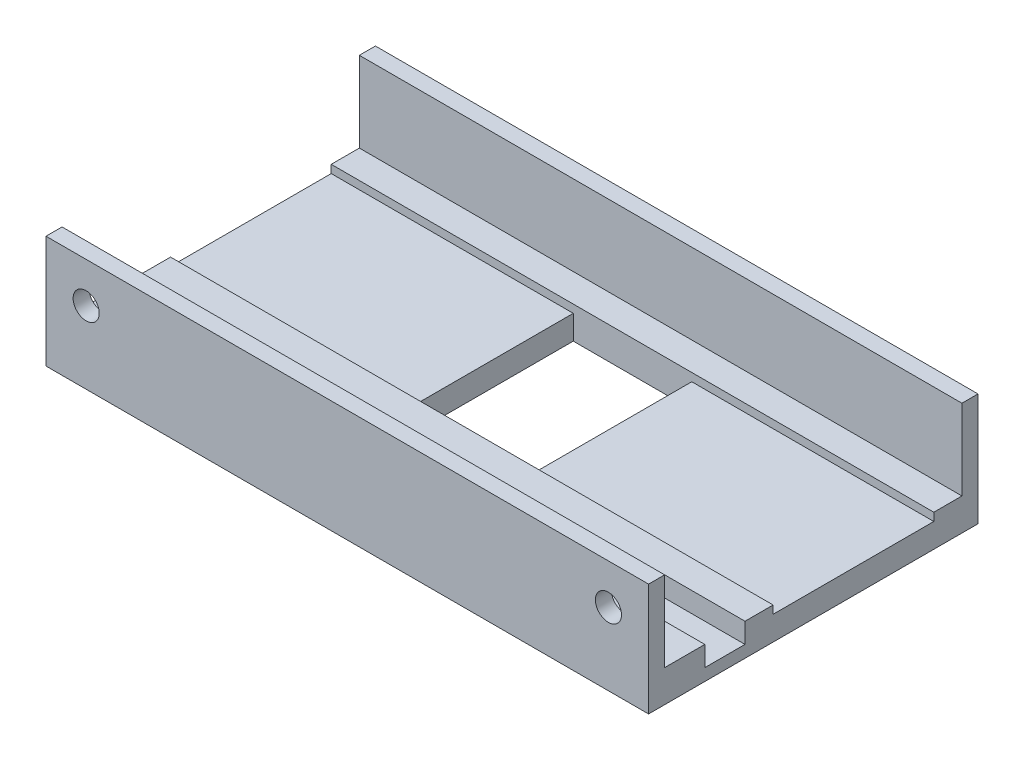
ISO-10303-21;
HEADER;
FILE_DESCRIPTION(('STEP AP214'),'2;1');
FILE_NAME('part.step','',(''),(''),'','','');
FILE_SCHEMA(('AUTOMOTIVE_DESIGN { 1 0 10303 214 1 1 1 1 }'));
ENDSEC;
DATA;
#1=APPLICATION_CONTEXT('core data for automotive mechanical design processes');
#2=APPLICATION_PROTOCOL_DEFINITION('international standard','automotive_design',2000,#1);
#3=PRODUCT_CONTEXT('',#1,'mechanical');
#4=PRODUCT('Part','Part','',(#3));
#5=PRODUCT_RELATED_PRODUCT_CATEGORY('part','',(#4));
#6=PRODUCT_DEFINITION_FORMATION('','',#4);
#7=PRODUCT_DEFINITION_CONTEXT('part definition',#1,'design');
#8=PRODUCT_DEFINITION('design','',#6,#7);
#9=PRODUCT_DEFINITION_SHAPE('','',#8);
#10=(LENGTH_UNIT() NAMED_UNIT(*) SI_UNIT(.MILLI.,.METRE.));
#11=(NAMED_UNIT(*) PLANE_ANGLE_UNIT() SI_UNIT($,.RADIAN.));
#12=(NAMED_UNIT(*) SI_UNIT($,.STERADIAN.) SOLID_ANGLE_UNIT());
#13=UNCERTAINTY_MEASURE_WITH_UNIT(LENGTH_MEASURE(1.E-05),#10,'distance_accuracy_value','');
#14=(GEOMETRIC_REPRESENTATION_CONTEXT(3) GLOBAL_UNCERTAINTY_ASSIGNED_CONTEXT((#13)) GLOBAL_UNIT_ASSIGNED_CONTEXT((#10,
#11,#12)) REPRESENTATION_CONTEXT('',''));
#15=CARTESIAN_POINT('',(0.,0.,0.));
#16=DIRECTION('',(0.,0.,1.));
#17=DIRECTION('',(1.,0.,0.));
#18=AXIS2_PLACEMENT_3D('',#15,#16,#17);
#19=CARTESIAN_POINT('',(37.5,4.,20.5));
#20=DIRECTION('',(0.,1.,0.));
#21=DIRECTION('',(0.,0.,1.));
#22=AXIS2_PLACEMENT_3D('',#19,#20,#21);
#23=PLANE('',#22);
#24=DIRECTION('',(-1.,0.,0.));
#25=VECTOR('',#24,1.);
#26=CARTESIAN_POINT('',(-7.375,4.,-15.));
#27=LINE('',#26,#25);
#28=CARTESIAN_POINT('',(37.5,4.,-15.));
#29=VERTEX_POINT('',#28);
#30=CARTESIAN_POINT('',(-37.5,4.,-15.));
#31=VERTEX_POINT('',#30);
#32=EDGE_CURVE('E297',#29,#31,#27,.T.);
#33=ORIENTED_EDGE('',*,*,#32,.F.);
#34=DIRECTION('',(0.,0.,-1.));
#35=VECTOR('',#34,1.);
#36=CARTESIAN_POINT('',(37.5,4.,-20.5));
#37=LINE('',#36,#35);
#38=CARTESIAN_POINT('',(37.5,4.,-18.5));
#39=VERTEX_POINT('',#38);
#40=EDGE_CURVE('E384',#29,#39,#37,.T.);
#41=ORIENTED_EDGE('',*,*,#40,.T.);
#42=DIRECTION('',(1.,0.,0.));
#43=VECTOR('',#42,1.);
#44=CARTESIAN_POINT('',(-37.5,4.,-18.5));
#45=LINE('',#44,#43);
#46=CARTESIAN_POINT('',(-37.5,4.,-18.5));
#47=VERTEX_POINT('',#46);
#48=EDGE_CURVE('E335',#47,#39,#45,.T.);
#49=ORIENTED_EDGE('',*,*,#48,.F.);
#50=DIRECTION('',(0.,0.,1.));
#51=VECTOR('',#50,1.);
#52=CARTESIAN_POINT('',(-37.5,4.,-20.5));
#53=LINE('',#52,#51);
#54=EDGE_CURVE('E366',#47,#31,#53,.T.);
#55=ORIENTED_EDGE('',*,*,#54,.T.);
#56=EDGE_LOOP('',(#33,#41,#49,#55));
#57=FACE_BOUND('',#56,.T.);
#58=ADVANCED_FACE('F33',(#57),#23,.T.);
#59=CARTESIAN_POINT('',(7.375,0.,-15.));
#60=DIRECTION('',(1.,0.,0.));
#61=DIRECTION('',(0.,0.,-1.));
#62=AXIS2_PLACEMENT_3D('',#59,#60,#61);
#63=PLANE('',#62);
#64=DIRECTION('',(0.,0.,1.));
#65=VECTOR('',#64,1.);
#66=CARTESIAN_POINT('',(7.375,3.,-15.));
#67=LINE('',#66,#65);
#68=CARTESIAN_POINT('',(7.375,3.,-15.));
#69=VERTEX_POINT('',#68);
#70=CARTESIAN_POINT('',(7.375,3.,5.00000000000001));
#71=VERTEX_POINT('',#70);
#72=EDGE_CURVE('E295',#69,#71,#67,.T.);
#73=ORIENTED_EDGE('',*,*,#72,.F.);
#74=DIRECTION('',(0.,1.,0.));
#75=VECTOR('',#74,1.);
#76=CARTESIAN_POINT('',(7.375,0.,-15.));
#77=LINE('',#76,#75);
#78=CARTESIAN_POINT('',(7.375,0.,-15.));
#79=VERTEX_POINT('',#78);
#80=EDGE_CURVE('E311',#79,#69,#77,.T.);
#81=ORIENTED_EDGE('',*,*,#80,.F.);
#82=DIRECTION('',(0.,0.,-1.));
#83=VECTOR('',#82,1.);
#84=CARTESIAN_POINT('',(7.375,0.,-15.));
#85=LINE('',#84,#83);
#86=CARTESIAN_POINT('',(7.375,0.,5.00000000000001));
#87=VERTEX_POINT('',#86);
#88=EDGE_CURVE('E298',#87,#79,#85,.T.);
#89=ORIENTED_EDGE('',*,*,#88,.F.);
#90=DIRECTION('',(0.,1.,0.));
#91=VECTOR('',#90,1.);
#92=CARTESIAN_POINT('',(7.375,0.,5.00000000000001));
#93=LINE('',#92,#91);
#94=EDGE_CURVE('E315',#87,#71,#93,.T.);
#95=ORIENTED_EDGE('',*,*,#94,.T.);
#96=EDGE_LOOP('',(#73,#81,#89,#95));
#97=FACE_BOUND('',#96,.T.);
#98=ADVANCED_FACE('F457',(#97),#63,.F.);
#99=CARTESIAN_POINT('',(-7.375,0.,-15.));
#100=DIRECTION('',(-1.,0.,0.));
#101=DIRECTION('',(0.,0.,1.));
#102=AXIS2_PLACEMENT_3D('',#99,#100,#101);
#103=PLANE('',#102);
#104=DIRECTION('',(0.,0.,-1.));
#105=VECTOR('',#104,1.);
#106=CARTESIAN_POINT('',(-7.375,3.,-15.));
#107=LINE('',#106,#105);
#108=CARTESIAN_POINT('',(-7.375,3.,5.00000000000001));
#109=VERTEX_POINT('',#108);
#110=CARTESIAN_POINT('',(-7.375,3.,-15.));
#111=VERTEX_POINT('',#110);
#112=EDGE_CURVE('E285',#109,#111,#107,.T.);
#113=ORIENTED_EDGE('',*,*,#112,.F.);
#114=DIRECTION('',(0.,1.,0.));
#115=VECTOR('',#114,1.);
#116=CARTESIAN_POINT('',(-7.375,0.,5.00000000000001));
#117=LINE('',#116,#115);
#118=CARTESIAN_POINT('',(-7.375,0.,5.00000000000001));
#119=VERTEX_POINT('',#118);
#120=EDGE_CURVE('E319',#119,#109,#117,.T.);
#121=ORIENTED_EDGE('',*,*,#120,.F.);
#122=DIRECTION('',(0.,0.,1.));
#123=VECTOR('',#122,1.);
#124=CARTESIAN_POINT('',(-7.375,0.,-15.));
#125=LINE('',#124,#123);
#126=CARTESIAN_POINT('',(-7.375,0.,-15.));
#127=VERTEX_POINT('',#126);
#128=EDGE_CURVE('E305',#127,#119,#125,.T.);
#129=ORIENTED_EDGE('',*,*,#128,.F.);
#130=DIRECTION('',(0.,1.,0.));
#131=VECTOR('',#130,1.);
#132=CARTESIAN_POINT('',(-7.375,0.,-15.));
#133=LINE('',#132,#131);
#134=EDGE_CURVE('E322',#127,#111,#133,.T.);
#135=ORIENTED_EDGE('',*,*,#134,.T.);
#136=EDGE_LOOP('',(#113,#121,#129,#135));
#137=FACE_BOUND('',#136,.T.);
#138=ADVANCED_FACE('F489',(#137),#103,.F.);
#139=DIRECTION('',(-1.,0.,0.));
#140=VECTOR('',#139,1.);
#141=CARTESIAN_POINT('',(27.,4.,8.49999999999994));
#142=LINE('',#141,#140);
#143=CARTESIAN_POINT('',(37.5,4.,8.49999999999994));
#144=VERTEX_POINT('',#143);
#145=CARTESIAN_POINT('',(27.,4.,8.49999999999994));
#146=VERTEX_POINT('',#145);
#147=EDGE_CURVE('E218',#144,#146,#142,.T.);
#148=ORIENTED_EDGE('',*,*,#147,.F.);
#149=CARTESIAN_POINT('',(37.5,4.,5.00000000000001));
#150=VERTEX_POINT('',#149);
#151=EDGE_CURVE('E37',#144,#150,#37,.T.);
#152=ORIENTED_EDGE('',*,*,#151,.T.);
#153=DIRECTION('',(1.,0.,0.));
#154=VECTOR('',#153,1.);
#155=CARTESIAN_POINT('',(-7.375,4.,5.00000000000001));
#156=LINE('',#155,#154);
#157=CARTESIAN_POINT('',(-37.5,4.,5.00000000000001));
#158=VERTEX_POINT('',#157);
#159=EDGE_CURVE('E302',#158,#150,#156,.T.);
#160=ORIENTED_EDGE('',*,*,#159,.F.);
#161=CARTESIAN_POINT('',(-37.5,4.,8.49999999999995));
#162=VERTEX_POINT('',#161);
#163=EDGE_CURVE('E381',#158,#162,#53,.T.);
#164=ORIENTED_EDGE('',*,*,#163,.T.);
#165=DIRECTION('',(-1.,0.,0.));
#166=VECTOR('',#165,1.);
#167=CARTESIAN_POINT('',(-27.,4.,8.49999999999995));
#168=LINE('',#167,#166);
#169=CARTESIAN_POINT('',(-27.,4.,8.49999999999995));
#170=VERTEX_POINT('',#169);
#171=EDGE_CURVE('E230',#170,#162,#168,.T.);
#172=ORIENTED_EDGE('',*,*,#171,.F.);
#173=DIRECTION('',(0.,0.,-1.));
#174=VECTOR('',#173,1.);
#175=CARTESIAN_POINT('',(-27.,4.,13.5));
#176=LINE('',#175,#174);
#177=CARTESIAN_POINT('',(-27.,4.,13.5));
#178=VERTEX_POINT('',#177);
#179=EDGE_CURVE('E236',#178,#170,#176,.T.);
#180=ORIENTED_EDGE('',*,*,#179,.F.);
#181=DIRECTION('',(1.,0.,0.));
#182=VECTOR('',#181,1.);
#183=CARTESIAN_POINT('',(-37.5,4.,13.5));
#184=LINE('',#183,#182);
#185=CARTESIAN_POINT('',(-37.5,4.,13.5));
#186=VERTEX_POINT('',#185);
#187=EDGE_CURVE('E245',#186,#178,#184,.T.);
#188=ORIENTED_EDGE('',*,*,#187,.F.);
#189=CARTESIAN_POINT('',(-37.5,4.,18.5));
#190=VERTEX_POINT('',#189);
#191=EDGE_CURVE('E380',#186,#190,#53,.T.);
#192=ORIENTED_EDGE('',*,*,#191,.T.);
#193=DIRECTION('',(-1.,0.,0.));
#194=VECTOR('',#193,1.);
#195=CARTESIAN_POINT('',(-37.5,4.,18.5));
#196=LINE('',#195,#194);
#197=CARTESIAN_POINT('',(37.5,4.,18.5));
#198=VERTEX_POINT('',#197);
#199=EDGE_CURVE('E327',#198,#190,#196,.T.);
#200=ORIENTED_EDGE('',*,*,#199,.F.);
#201=CARTESIAN_POINT('',(37.5,4.,13.5));
#202=VERTEX_POINT('',#201);
#203=EDGE_CURVE('E377',#198,#202,#37,.T.);
#204=ORIENTED_EDGE('',*,*,#203,.T.);
#205=DIRECTION('',(1.,0.,0.));
#206=VECTOR('',#205,1.);
#207=CARTESIAN_POINT('',(37.5,4.,13.5));
#208=LINE('',#207,#206);
#209=CARTESIAN_POINT('',(27.,4.,13.5));
#210=VERTEX_POINT('',#209);
#211=EDGE_CURVE('E221',#210,#202,#208,.T.);
#212=ORIENTED_EDGE('',*,*,#211,.F.);
#213=DIRECTION('',(0.,0.,1.));
#214=VECTOR('',#213,1.);
#215=CARTESIAN_POINT('',(27.,4.,13.5));
#216=LINE('',#215,#214);
#217=EDGE_CURVE('E205',#146,#210,#216,.T.);
#218=ORIENTED_EDGE('',*,*,#217,.F.);
#219=EDGE_LOOP('',(#148,#152,#160,#164,#172,#180,#188,#192,#200,#204,#212,#218));
#220=FACE_BOUND('',#219,.T.);
#221=ADVANCED_FACE('F395',(#220),#23,.T.);
#222=CARTESIAN_POINT('',(37.5,4.,-20.5));
#223=DIRECTION('',(-1.,0.,0.));
#224=DIRECTION('',(0.,0.,1.));
#225=AXIS2_PLACEMENT_3D('',#222,#223,#224);
#226=PLANE('',#225);
#227=ORIENTED_EDGE('',*,*,#151,.F.);
#228=DIRECTION('',(0.,1.,0.));
#229=VECTOR('',#228,1.);
#230=CARTESIAN_POINT('',(37.5,1.5,8.49999999999994));
#231=LINE('',#230,#229);
#232=CARTESIAN_POINT('',(37.5,1.5,8.49999999999994));
#233=VERTEX_POINT('',#232);
#234=EDGE_CURVE('E231',#233,#144,#231,.T.);
#235=ORIENTED_EDGE('',*,*,#234,.F.);
#236=DIRECTION('',(0.,0.,-1.));
#237=VECTOR('',#236,1.);
#238=CARTESIAN_POINT('',(37.5,1.5,8.49999999999994));
#239=LINE('',#238,#237);
#240=CARTESIAN_POINT('',(37.5,1.5,13.5));
#241=VERTEX_POINT('',#240);
#242=EDGE_CURVE('E214',#241,#233,#239,.T.);
#243=ORIENTED_EDGE('',*,*,#242,.F.);
#244=DIRECTION('',(0.,1.,0.));
#245=VECTOR('',#244,1.);
#246=CARTESIAN_POINT('',(37.5,1.5,13.5));
#247=LINE('',#246,#245);
#248=EDGE_CURVE('E208',#241,#202,#247,.T.);
#249=ORIENTED_EDGE('',*,*,#248,.T.);
#250=ORIENTED_EDGE('',*,*,#203,.F.);
#251=DIRECTION('',(0.,-1.,0.));
#252=VECTOR('',#251,1.);
#253=CARTESIAN_POINT('',(37.5,89.0266619276108,18.5));
#254=LINE('',#253,#252);
#255=CARTESIAN_POINT('',(37.5,14.,18.5));
#256=VERTEX_POINT('',#255);
#257=EDGE_CURVE('E331',#256,#198,#254,.T.);
#258=ORIENTED_EDGE('',*,*,#257,.F.);
#259=DIRECTION('',(0.,0.,-1.));
#260=VECTOR('',#259,1.);
#261=CARTESIAN_POINT('',(37.5,14.,20.5));
#262=LINE('',#261,#260);
#263=CARTESIAN_POINT('',(37.5,14.,20.5));
#264=VERTEX_POINT('',#263);
#265=EDGE_CURVE('E332',#264,#256,#262,.T.);
#266=ORIENTED_EDGE('',*,*,#265,.F.);
#267=DIRECTION('',(0.,-1.,0.));
#268=VECTOR('',#267,1.);
#269=CARTESIAN_POINT('',(37.5,4.,20.5));
#270=LINE('',#269,#268);
#271=CARTESIAN_POINT('',(37.5,0.,20.5));
#272=VERTEX_POINT('',#271);
#273=EDGE_CURVE('E425',#264,#272,#270,.T.);
#274=ORIENTED_EDGE('',*,*,#273,.T.);
#275=DIRECTION('',(0.,0.,-1.));
#276=VECTOR('',#275,1.);
#277=CARTESIAN_POINT('',(37.5,0.,-20.5));
#278=LINE('',#277,#276);
#279=CARTESIAN_POINT('',(37.5,0.,-20.5));
#280=VERTEX_POINT('',#279);
#281=EDGE_CURVE('E374',#272,#280,#278,.T.);
#282=ORIENTED_EDGE('',*,*,#281,.T.);
#283=DIRECTION('',(0.,-1.,0.));
#284=VECTOR('',#283,1.);
#285=CARTESIAN_POINT('',(37.5,4.,-20.5));
#286=LINE('',#285,#284);
#287=CARTESIAN_POINT('',(37.5,14.,-20.5));
#288=VERTEX_POINT('',#287);
#289=EDGE_CURVE('E11',#288,#280,#286,.T.);
#290=ORIENTED_EDGE('',*,*,#289,.F.);
#291=DIRECTION('',(0.,0.,-1.));
#292=VECTOR('',#291,1.);
#293=CARTESIAN_POINT('',(37.5,14.,-20.5));
#294=LINE('',#293,#292);
#295=CARTESIAN_POINT('',(37.5,14.,-18.5));
#296=VERTEX_POINT('',#295);
#297=EDGE_CURVE('E352',#296,#288,#294,.T.);
#298=ORIENTED_EDGE('',*,*,#297,.F.);
#299=DIRECTION('',(0.,-1.,0.));
#300=VECTOR('',#299,1.);
#301=CARTESIAN_POINT('',(37.5,14.,-18.5));
#302=LINE('',#301,#300);
#303=EDGE_CURVE('E358',#296,#39,#302,.T.);
#304=ORIENTED_EDGE('',*,*,#303,.T.);
#305=ORIENTED_EDGE('',*,*,#40,.F.);
#306=DIRECTION('',(0.,1.,0.));
#307=VECTOR('',#306,1.);
#308=CARTESIAN_POINT('',(37.5,3.,-15.));
#309=LINE('',#308,#307);
#310=CARTESIAN_POINT('',(37.5,3.,-15.));
#311=VERTEX_POINT('',#310);
#312=EDGE_CURVE('E286',#311,#29,#309,.T.);
#313=ORIENTED_EDGE('',*,*,#312,.F.);
#314=DIRECTION('',(0.,0.,-1.));
#315=VECTOR('',#314,1.);
#316=CARTESIAN_POINT('',(37.5,3.,-15.));
#317=LINE('',#316,#315);
#318=CARTESIAN_POINT('',(37.5,3.,5.00000000000001));
#319=VERTEX_POINT('',#318);
#320=EDGE_CURVE('E276',#319,#311,#317,.T.);
#321=ORIENTED_EDGE('',*,*,#320,.F.);
#322=DIRECTION('',(0.,1.,0.));
#323=VECTOR('',#322,1.);
#324=CARTESIAN_POINT('',(37.5,3.,5.00000000000001));
#325=LINE('',#324,#323);
#326=EDGE_CURVE('E289',#319,#150,#325,.T.);
#327=ORIENTED_EDGE('',*,*,#326,.T.);
#328=EDGE_LOOP('',(#227,#235,#243,#249,#250,#258,#266,#274,#282,#290,#298,#304,#305,#313,#321,#327));
#329=FACE_BOUND('',#328,.T.);
#330=ADVANCED_FACE('F35',(#329),#226,.F.);
#331=CARTESIAN_POINT('',(-37.5,4.,-20.5));
#332=DIRECTION('',(0.,0.,1.));
#333=DIRECTION('',(1.,0.,0.));
#334=AXIS2_PLACEMENT_3D('',#331,#332,#333);
#335=PLANE('',#334);
#336=DIRECTION('',(-1.,0.,0.));
#337=VECTOR('',#336,1.);
#338=CARTESIAN_POINT('',(-37.5,0.,-20.5));
#339=LINE('',#338,#337);
#340=CARTESIAN_POINT('',(-37.5,0.,-20.5));
#341=VERTEX_POINT('',#340);
#342=EDGE_CURVE('E422',#280,#341,#339,.T.);
#343=ORIENTED_EDGE('',*,*,#342,.T.);
#344=DIRECTION('',(0.,-1.,0.));
#345=VECTOR('',#344,1.);
#346=CARTESIAN_POINT('',(-37.5,4.,-20.5));
#347=LINE('',#346,#345);
#348=CARTESIAN_POINT('',(-37.5,14.,-20.5));
#349=VERTEX_POINT('',#348);
#350=EDGE_CURVE('E43',#349,#341,#347,.T.);
#351=ORIENTED_EDGE('',*,*,#350,.F.);
#352=DIRECTION('',(-1.,0.,0.));
#353=VECTOR('',#352,1.);
#354=CARTESIAN_POINT('',(-37.5,14.,-20.5));
#355=LINE('',#354,#353);
#356=EDGE_CURVE('E355',#288,#349,#355,.T.);
#357=ORIENTED_EDGE('',*,*,#356,.F.);
#358=ORIENTED_EDGE('',*,*,#289,.T.);
#359=EDGE_LOOP('',(#343,#351,#357,#358));
#360=FACE_BOUND('',#359,.T.);
#361=ADVANCED_FACE('F439',(#360),#335,.F.);
#362=CARTESIAN_POINT('',(-37.5,4.,-20.5));
#363=DIRECTION('',(1.,0.,0.));
#364=DIRECTION('',(0.,0.,-1.));
#365=AXIS2_PLACEMENT_3D('',#362,#363,#364);
#366=PLANE('',#365);
#367=DIRECTION('',(0.,0.,1.));
#368=VECTOR('',#367,1.);
#369=CARTESIAN_POINT('',(-37.5,1.5,8.49999999999995));
#370=LINE('',#369,#368);
#371=CARTESIAN_POINT('',(-37.5,1.5,8.49999999999996));
#372=VERTEX_POINT('',#371);
#373=CARTESIAN_POINT('',(-37.5,1.5,13.5));
#374=VERTEX_POINT('',#373);
#375=EDGE_CURVE('E235',#372,#374,#370,.T.);
#376=ORIENTED_EDGE('',*,*,#375,.F.);
#377=DIRECTION('',(0.,1.,0.));
#378=VECTOR('',#377,1.);
#379=CARTESIAN_POINT('',(-37.5,1.5,8.49999999999995));
#380=LINE('',#379,#378);
#381=EDGE_CURVE('E243',#372,#162,#380,.T.);
#382=ORIENTED_EDGE('',*,*,#381,.T.);
#383=ORIENTED_EDGE('',*,*,#163,.F.);
#384=DIRECTION('',(0.,1.,0.));
#385=VECTOR('',#384,1.);
#386=CARTESIAN_POINT('',(-37.5,3.,5.00000000000001));
#387=LINE('',#386,#385);
#388=CARTESIAN_POINT('',(-37.5,3.,5.00000000000001));
#389=VERTEX_POINT('',#388);
#390=EDGE_CURVE('E281',#389,#158,#387,.T.);
#391=ORIENTED_EDGE('',*,*,#390,.F.);
#392=DIRECTION('',(0.,0.,1.));
#393=VECTOR('',#392,1.);
#394=CARTESIAN_POINT('',(-37.5,3.,-15.));
#395=LINE('',#394,#393);
#396=CARTESIAN_POINT('',(-37.5,3.,-15.));
#397=VERTEX_POINT('',#396);
#398=EDGE_CURVE('E270',#397,#389,#395,.T.);
#399=ORIENTED_EDGE('',*,*,#398,.F.);
#400=DIRECTION('',(0.,1.,0.));
#401=VECTOR('',#400,1.);
#402=CARTESIAN_POINT('',(-37.5,3.,-15.));
#403=LINE('',#402,#401);
#404=EDGE_CURVE('E282',#397,#31,#403,.T.);
#405=ORIENTED_EDGE('',*,*,#404,.T.);
#406=ORIENTED_EDGE('',*,*,#54,.F.);
#407=DIRECTION('',(0.,-1.,0.));
#408=VECTOR('',#407,1.);
#409=CARTESIAN_POINT('',(-37.5,14.,-18.5));
#410=LINE('',#409,#408);
#411=CARTESIAN_POINT('',(-37.5,14.,-18.5));
#412=VERTEX_POINT('',#411);
#413=EDGE_CURVE('E369',#412,#47,#410,.T.);
#414=ORIENTED_EDGE('',*,*,#413,.F.);
#415=DIRECTION('',(0.,0.,1.));
#416=VECTOR('',#415,1.);
#417=CARTESIAN_POINT('',(-37.5,14.,-20.5));
#418=LINE('',#417,#416);
#419=EDGE_CURVE('E347',#349,#412,#418,.T.);
#420=ORIENTED_EDGE('',*,*,#419,.F.);
#421=ORIENTED_EDGE('',*,*,#350,.T.);
#422=DIRECTION('',(0.,0.,1.));
#423=VECTOR('',#422,1.);
#424=CARTESIAN_POINT('',(-37.5,0.,-20.5));
#425=LINE('',#424,#423);
#426=CARTESIAN_POINT('',(-37.5,0.,20.5));
#427=VERTEX_POINT('',#426);
#428=EDGE_CURVE('E417',#341,#427,#425,.T.);
#429=ORIENTED_EDGE('',*,*,#428,.T.);
#430=DIRECTION('',(0.,-1.,0.));
#431=VECTOR('',#430,1.);
#432=CARTESIAN_POINT('',(-37.5,4.,20.5));
#433=LINE('',#432,#431);
#434=CARTESIAN_POINT('',(-37.5,14.,20.5));
#435=VERTEX_POINT('',#434);
#436=EDGE_CURVE('E427',#435,#427,#433,.T.);
#437=ORIENTED_EDGE('',*,*,#436,.F.);
#438=DIRECTION('',(0.,0.,1.));
#439=VECTOR('',#438,1.);
#440=CARTESIAN_POINT('',(-37.5,14.,20.5));
#441=LINE('',#440,#439);
#442=CARTESIAN_POINT('',(-37.5,14.,18.5));
#443=VERTEX_POINT('',#442);
#444=EDGE_CURVE('E339',#443,#435,#441,.T.);
#445=ORIENTED_EDGE('',*,*,#444,.F.);
#446=DIRECTION('',(0.,-1.,0.));
#447=VECTOR('',#446,1.);
#448=CARTESIAN_POINT('',(-37.5,89.0266619276108,18.5));
#449=LINE('',#448,#447);
#450=EDGE_CURVE('E318',#443,#190,#449,.T.);
#451=ORIENTED_EDGE('',*,*,#450,.T.);
#452=ORIENTED_EDGE('',*,*,#191,.F.);
#453=DIRECTION('',(0.,1.,0.));
#454=VECTOR('',#453,1.);
#455=CARTESIAN_POINT('',(-37.5,1.5,13.5));
#456=LINE('',#455,#454);
#457=EDGE_CURVE('E255',#374,#186,#456,.T.);
#458=ORIENTED_EDGE('',*,*,#457,.F.);
#459=EDGE_LOOP('',(#376,#382,#383,#391,#399,#405,#406,#414,#420,#421,#429,#437,#445,#451,#452,#458));
#460=FACE_BOUND('',#459,.T.);
#461=ADVANCED_FACE('F402',(#460),#366,.F.);
#462=CARTESIAN_POINT('',(-37.5,4.,20.5));
#463=DIRECTION('',(0.,0.,-1.));
#464=DIRECTION('',(-1.,0.,0.));
#465=AXIS2_PLACEMENT_3D('',#462,#463,#464);
#466=PLANE('',#465);
#467=CARTESIAN_POINT('',(32.5,8.99999999999999,20.5));
#468=DIRECTION('',(0.,0.,1.));
#469=DIRECTION('',(-1.,0.,0.));
#470=AXIS2_PLACEMENT_3D('',#467,#468,#469);
#471=CIRCLE('',#470,1.625);
#472=CARTESIAN_POINT('',(30.875,8.99999999999999,20.5));
#473=VERTEX_POINT('',#472);
#474=EDGE_CURVE('E252',#473,#473,#471,.T.);
#475=ORIENTED_EDGE('',*,*,#474,.F.);
#476=EDGE_LOOP('',(#475));
#477=FACE_BOUND('',#476,.T.);
#478=CARTESIAN_POINT('',(-32.5,9.,20.5));
#479=DIRECTION('',(0.,0.,1.));
#480=DIRECTION('',(1.,0.,0.));
#481=AXIS2_PLACEMENT_3D('',#478,#479,#480);
#482=CIRCLE('',#481,1.625);
#483=CARTESIAN_POINT('',(-30.875,9.,20.5));
#484=VERTEX_POINT('',#483);
#485=EDGE_CURVE('E264',#484,#484,#482,.T.);
#486=ORIENTED_EDGE('',*,*,#485,.F.);
#487=EDGE_LOOP('',(#486));
#488=FACE_BOUND('',#487,.T.);
#489=DIRECTION('',(1.,0.,0.));
#490=VECTOR('',#489,1.);
#491=CARTESIAN_POINT('',(-37.5,0.,20.5));
#492=LINE('',#491,#490);
#493=EDGE_CURVE('E414',#427,#272,#492,.T.);
#494=ORIENTED_EDGE('',*,*,#493,.T.);
#495=ORIENTED_EDGE('',*,*,#273,.F.);
#496=DIRECTION('',(1.,0.,0.));
#497=VECTOR('',#496,1.);
#498=CARTESIAN_POINT('',(-37.5,14.,20.5));
#499=LINE('',#498,#497);
#500=EDGE_CURVE('E336',#435,#264,#499,.T.);
#501=ORIENTED_EDGE('',*,*,#500,.F.);
#502=ORIENTED_EDGE('',*,*,#436,.T.);
#503=EDGE_LOOP('',(#494,#495,#501,#502));
#504=FACE_BOUND('',#503,.T.);
#505=ADVANCED_FACE('F521',(#477,#488,#504),#466,.F.);
#506=CARTESIAN_POINT('',(37.5,0.,20.5));
#507=DIRECTION('',(0.,1.,0.));
#508=DIRECTION('',(0.,0.,1.));
#509=AXIS2_PLACEMENT_3D('',#506,#507,#508);
#510=PLANE('',#509);
#511=DIRECTION('',(1.,0.,0.));
#512=VECTOR('',#511,1.);
#513=CARTESIAN_POINT('',(-7.375,0.,5.00000000000001));
#514=LINE('',#513,#512);
#515=EDGE_CURVE('E308',#119,#87,#514,.T.);
#516=ORIENTED_EDGE('',*,*,#515,.T.);
#517=ORIENTED_EDGE('',*,*,#88,.T.);
#518=DIRECTION('',(-1.,0.,0.));
#519=VECTOR('',#518,1.);
#520=CARTESIAN_POINT('',(-7.375,0.,-15.));
#521=LINE('',#520,#519);
#522=EDGE_CURVE('E301',#79,#127,#521,.T.);
#523=ORIENTED_EDGE('',*,*,#522,.T.);
#524=ORIENTED_EDGE('',*,*,#128,.T.);
#525=EDGE_LOOP('',(#516,#517,#523,#524));
#526=FACE_BOUND('',#525,.T.);
#527=ORIENTED_EDGE('',*,*,#281,.F.);
#528=ORIENTED_EDGE('',*,*,#493,.F.);
#529=ORIENTED_EDGE('',*,*,#428,.F.);
#530=ORIENTED_EDGE('',*,*,#342,.F.);
#531=EDGE_LOOP('',(#527,#528,#529,#530));
#532=FACE_BOUND('',#531,.T.);
#533=ADVANCED_FACE('F437',(#526,#532),#510,.F.);
#534=CARTESIAN_POINT('',(-37.5,14.,-18.5));
#535=DIRECTION('',(0.,0.,-1.));
#536=DIRECTION('',(-1.,0.,0.));
#537=AXIS2_PLACEMENT_3D('',#534,#535,#536);
#538=PLANE('',#537);
#539=ORIENTED_EDGE('',*,*,#48,.T.);
#540=ORIENTED_EDGE('',*,*,#303,.F.);
#541=DIRECTION('',(1.,0.,0.));
#542=VECTOR('',#541,1.);
#543=CARTESIAN_POINT('',(-37.5,14.,-18.5));
#544=LINE('',#543,#542);
#545=EDGE_CURVE('E350',#412,#296,#544,.T.);
#546=ORIENTED_EDGE('',*,*,#545,.F.);
#547=ORIENTED_EDGE('',*,*,#413,.T.);
#548=EDGE_LOOP('',(#539,#540,#546,#547));
#549=FACE_BOUND('',#548,.T.);
#550=ADVANCED_FACE('F445',(#549),#538,.F.);
#551=CARTESIAN_POINT('',(-37.5,14.,-18.5));
#552=DIRECTION('',(0.,1.,0.));
#553=DIRECTION('',(0.,0.,1.));
#554=AXIS2_PLACEMENT_3D('',#551,#552,#553);
#555=PLANE('',#554);
#556=ORIENTED_EDGE('',*,*,#419,.T.);
#557=ORIENTED_EDGE('',*,*,#545,.T.);
#558=ORIENTED_EDGE('',*,*,#297,.T.);
#559=ORIENTED_EDGE('',*,*,#356,.T.);
#560=EDGE_LOOP('',(#556,#557,#558,#559));
#561=FACE_BOUND('',#560,.T.);
#562=ADVANCED_FACE('F442',(#561),#555,.T.);
#563=CARTESIAN_POINT('',(-37.5,89.0266619276108,18.5));
#564=DIRECTION('',(0.,0.,1.));
#565=DIRECTION('',(1.,0.,0.));
#566=AXIS2_PLACEMENT_3D('',#563,#564,#565);
#567=PLANE('',#566);
#568=CARTESIAN_POINT('',(32.5,8.99999999999999,18.5));
#569=DIRECTION('',(0.,0.,1.));
#570=DIRECTION('',(1.,0.,0.));
#571=AXIS2_PLACEMENT_3D('',#568,#569,#570);
#572=CIRCLE('',#571,1.625);
#573=CARTESIAN_POINT('',(34.125,8.99999999999999,18.5));
#574=VERTEX_POINT('',#573);
#575=EDGE_CURVE('E261',#574,#574,#572,.F.);
#576=ORIENTED_EDGE('',*,*,#575,.F.);
#577=EDGE_LOOP('',(#576));
#578=FACE_BOUND('',#577,.T.);
#579=CARTESIAN_POINT('',(-32.5,9.,18.5));
#580=DIRECTION('',(0.,0.,1.));
#581=DIRECTION('',(1.,0.,0.));
#582=AXIS2_PLACEMENT_3D('',#579,#580,#581);
#583=CIRCLE('',#582,1.625);
#584=CARTESIAN_POINT('',(-30.875,9.,18.5));
#585=VERTEX_POINT('',#584);
#586=EDGE_CURVE('E267',#585,#585,#583,.F.);
#587=ORIENTED_EDGE('',*,*,#586,.F.);
#588=EDGE_LOOP('',(#587));
#589=FACE_BOUND('',#588,.T.);
#590=DIRECTION('',(-1.,0.,0.));
#591=VECTOR('',#590,1.);
#592=CARTESIAN_POINT('',(-37.5,14.,18.5));
#593=LINE('',#592,#591);
#594=EDGE_CURVE('E330',#256,#443,#593,.T.);
#595=ORIENTED_EDGE('',*,*,#594,.F.);
#596=ORIENTED_EDGE('',*,*,#257,.T.);
#597=ORIENTED_EDGE('',*,*,#199,.T.);
#598=ORIENTED_EDGE('',*,*,#450,.F.);
#599=EDGE_LOOP('',(#595,#596,#597,#598));
#600=FACE_BOUND('',#599,.T.);
#601=ADVANCED_FACE('F405',(#578,#589,#600),#567,.F.);
#602=CARTESIAN_POINT('',(-37.5,14.,-18.5));
#603=DIRECTION('',(0.,1.,0.));
#604=DIRECTION('',(0.,0.,1.));
#605=AXIS2_PLACEMENT_3D('',#602,#603,#604);
#606=PLANE('',#605);
#607=ORIENTED_EDGE('',*,*,#594,.T.);
#608=ORIENTED_EDGE('',*,*,#444,.T.);
#609=ORIENTED_EDGE('',*,*,#500,.T.);
#610=ORIENTED_EDGE('',*,*,#265,.T.);
#611=EDGE_LOOP('',(#607,#608,#609,#610));
#612=FACE_BOUND('',#611,.T.);
#613=ADVANCED_FACE('F511',(#612),#606,.T.);
#614=CARTESIAN_POINT('',(-7.375,0.,5.00000000000001));
#615=DIRECTION('',(0.,0.,1.));
#616=DIRECTION('',(1.,0.,0.));
#617=AXIS2_PLACEMENT_3D('',#614,#615,#616);
#618=PLANE('',#617);
#619=ORIENTED_EDGE('',*,*,#159,.T.);
#620=ORIENTED_EDGE('',*,*,#326,.F.);
#621=DIRECTION('',(1.,0.,0.));
#622=VECTOR('',#621,1.);
#623=CARTESIAN_POINT('',(-37.5,3.,5.00000000000001));
#624=LINE('',#623,#622);
#625=EDGE_CURVE('E273',#71,#319,#624,.T.);
#626=ORIENTED_EDGE('',*,*,#625,.F.);
#627=ORIENTED_EDGE('',*,*,#94,.F.);
#628=ORIENTED_EDGE('',*,*,#515,.F.);
#629=ORIENTED_EDGE('',*,*,#120,.T.);
#630=EDGE_CURVE('E274',#389,#109,#624,.T.);
#631=ORIENTED_EDGE('',*,*,#630,.F.);
#632=ORIENTED_EDGE('',*,*,#390,.T.);
#633=EDGE_LOOP('',(#619,#620,#626,#627,#628,#629,#631,#632));
#634=FACE_BOUND('',#633,.T.);
#635=ADVANCED_FACE('F461',(#634),#618,.F.);
#636=CARTESIAN_POINT('',(-7.375,0.,-15.));
#637=DIRECTION('',(0.,0.,-1.));
#638=DIRECTION('',(-1.,0.,0.));
#639=AXIS2_PLACEMENT_3D('',#636,#637,#638);
#640=PLANE('',#639);
#641=ORIENTED_EDGE('',*,*,#32,.T.);
#642=ORIENTED_EDGE('',*,*,#404,.F.);
#643=DIRECTION('',(-1.,0.,0.));
#644=VECTOR('',#643,1.);
#645=CARTESIAN_POINT('',(-37.5,3.,-15.));
#646=LINE('',#645,#644);
#647=EDGE_CURVE('E278',#111,#397,#646,.T.);
#648=ORIENTED_EDGE('',*,*,#647,.F.);
#649=ORIENTED_EDGE('',*,*,#134,.F.);
#650=ORIENTED_EDGE('',*,*,#522,.F.);
#651=ORIENTED_EDGE('',*,*,#80,.T.);
#652=EDGE_CURVE('E279',#311,#69,#646,.T.);
#653=ORIENTED_EDGE('',*,*,#652,.F.);
#654=ORIENTED_EDGE('',*,*,#312,.T.);
#655=EDGE_LOOP('',(#641,#642,#648,#649,#650,#651,#653,#654));
#656=FACE_BOUND('',#655,.T.);
#657=ADVANCED_FACE('F449',(#656),#640,.F.);
#658=CARTESIAN_POINT('',(-37.5,3.,5.00000000000001));
#659=DIRECTION('',(0.,1.,0.));
#660=DIRECTION('',(0.,0.,1.));
#661=AXIS2_PLACEMENT_3D('',#658,#659,#660);
#662=PLANE('',#661);
#663=ORIENTED_EDGE('',*,*,#112,.T.);
#664=ORIENTED_EDGE('',*,*,#647,.T.);
#665=ORIENTED_EDGE('',*,*,#398,.T.);
#666=ORIENTED_EDGE('',*,*,#630,.T.);
#667=EDGE_LOOP('',(#663,#664,#665,#666));
#668=FACE_BOUND('',#667,.T.);
#669=ADVANCED_FACE('F507',(#668),#662,.T.);
#670=ORIENTED_EDGE('',*,*,#72,.T.);
#671=ORIENTED_EDGE('',*,*,#625,.T.);
#672=ORIENTED_EDGE('',*,*,#320,.T.);
#673=ORIENTED_EDGE('',*,*,#652,.T.);
#674=EDGE_LOOP('',(#670,#671,#672,#673));
#675=FACE_BOUND('',#674,.T.);
#676=ADVANCED_FACE('F454',(#675),#662,.T.);
#677=CARTESIAN_POINT('',(-32.5,9.,13.9038059222874));
#678=DIRECTION('',(0.,0.,1.));
#679=DIRECTION('',(1.,0.,0.));
#680=AXIS2_PLACEMENT_3D('',#677,#678,#679);
#681=CYLINDRICAL_SURFACE('',#680,1.625);
#682=ORIENTED_EDGE('',*,*,#586,.T.);
#683=EDGE_LOOP('',(#682));
#684=FACE_BOUND('',#683,.T.);
#685=ORIENTED_EDGE('',*,*,#485,.T.);
#686=EDGE_LOOP('',(#685));
#687=FACE_BOUND('',#686,.T.);
#688=ADVANCED_FACE('F562',(#684,#687),#681,.F.);
#689=CARTESIAN_POINT('',(32.5,8.99999999999999,13.9038059222874));
#690=DIRECTION('',(0.,0.,1.));
#691=DIRECTION('',(1.,0.,0.));
#692=AXIS2_PLACEMENT_3D('',#689,#690,#691);
#693=CYLINDRICAL_SURFACE('',#692,1.625);
#694=ORIENTED_EDGE('',*,*,#575,.T.);
#695=EDGE_LOOP('',(#694));
#696=FACE_BOUND('',#695,.T.);
#697=ORIENTED_EDGE('',*,*,#474,.T.);
#698=EDGE_LOOP('',(#697));
#699=FACE_BOUND('',#698,.T.);
#700=ADVANCED_FACE('F567',(#696,#699),#693,.F.);
#701=CARTESIAN_POINT('',(-27.,1.5,8.49999999999995));
#702=DIRECTION('',(0.,0.,-1.));
#703=DIRECTION('',(-1.,0.,0.));
#704=AXIS2_PLACEMENT_3D('',#701,#702,#703);
#705=PLANE('',#704);
#706=ORIENTED_EDGE('',*,*,#171,.T.);
#707=ORIENTED_EDGE('',*,*,#381,.F.);
#708=DIRECTION('',(-1.,0.,0.));
#709=VECTOR('',#708,1.);
#710=CARTESIAN_POINT('',(-27.,1.5,8.49999999999995));
#711=LINE('',#710,#709);
#712=CARTESIAN_POINT('',(-27.,1.5,8.49999999999995));
#713=VERTEX_POINT('',#712);
#714=EDGE_CURVE('E59',#713,#372,#711,.T.);
#715=ORIENTED_EDGE('',*,*,#714,.F.);
#716=DIRECTION('',(0.,1.,0.));
#717=VECTOR('',#716,1.);
#718=CARTESIAN_POINT('',(-27.,1.5,8.49999999999995));
#719=LINE('',#718,#717);
#720=EDGE_CURVE('E250',#713,#170,#719,.T.);
#721=ORIENTED_EDGE('',*,*,#720,.T.);
#722=EDGE_LOOP('',(#706,#707,#715,#721));
#723=FACE_BOUND('',#722,.T.);
#724=ADVANCED_FACE('F467',(#723),#705,.F.);
#725=CARTESIAN_POINT('',(-27.,1.5,13.5));
#726=DIRECTION('',(1.,0.,0.));
#727=DIRECTION('',(0.,0.,-1.));
#728=AXIS2_PLACEMENT_3D('',#725,#726,#727);
#729=PLANE('',#728);
#730=ORIENTED_EDGE('',*,*,#179,.T.);
#731=ORIENTED_EDGE('',*,*,#720,.F.);
#732=DIRECTION('',(0.,0.,-1.));
#733=VECTOR('',#732,1.);
#734=CARTESIAN_POINT('',(-27.,1.5,13.5));
#735=LINE('',#734,#733);
#736=CARTESIAN_POINT('',(-27.,1.5,13.5));
#737=VERTEX_POINT('',#736);
#738=EDGE_CURVE('E241',#737,#713,#735,.T.);
#739=ORIENTED_EDGE('',*,*,#738,.F.);
#740=DIRECTION('',(0.,1.,0.));
#741=VECTOR('',#740,1.);
#742=CARTESIAN_POINT('',(-27.,1.5,13.5));
#743=LINE('',#742,#741);
#744=EDGE_CURVE('E253',#737,#178,#743,.T.);
#745=ORIENTED_EDGE('',*,*,#744,.T.);
#746=EDGE_LOOP('',(#730,#731,#739,#745));
#747=FACE_BOUND('',#746,.T.);
#748=ADVANCED_FACE('F470',(#747),#729,.F.);
#749=CARTESIAN_POINT('',(-37.5,1.5,13.5));
#750=DIRECTION('',(0.,0.,1.));
#751=DIRECTION('',(1.,0.,0.));
#752=AXIS2_PLACEMENT_3D('',#749,#750,#751);
#753=PLANE('',#752);
#754=ORIENTED_EDGE('',*,*,#187,.T.);
#755=ORIENTED_EDGE('',*,*,#744,.F.);
#756=DIRECTION('',(1.,0.,0.));
#757=VECTOR('',#756,1.);
#758=CARTESIAN_POINT('',(-37.5,1.5,13.5));
#759=LINE('',#758,#757);
#760=EDGE_CURVE('E238',#374,#737,#759,.T.);
#761=ORIENTED_EDGE('',*,*,#760,.F.);
#762=ORIENTED_EDGE('',*,*,#457,.T.);
#763=EDGE_LOOP('',(#754,#755,#761,#762));
#764=FACE_BOUND('',#763,.T.);
#765=ADVANCED_FACE('F472',(#764),#753,.F.);
#766=CARTESIAN_POINT('',(-37.5,1.5,8.49999999999995));
#767=DIRECTION('',(0.,1.,0.));
#768=DIRECTION('',(0.,0.,1.));
#769=AXIS2_PLACEMENT_3D('',#766,#767,#768);
#770=PLANE('',#769);
#771=ORIENTED_EDGE('',*,*,#714,.T.);
#772=ORIENTED_EDGE('',*,*,#375,.T.);
#773=ORIENTED_EDGE('',*,*,#760,.T.);
#774=ORIENTED_EDGE('',*,*,#738,.T.);
#775=EDGE_LOOP('',(#771,#772,#773,#774));
#776=FACE_BOUND('',#775,.T.);
#777=ADVANCED_FACE('F473',(#776),#770,.T.);
#778=CARTESIAN_POINT('',(27.,1.5,13.5));
#779=DIRECTION('',(-1.,0.,0.));
#780=DIRECTION('',(0.,0.,1.));
#781=AXIS2_PLACEMENT_3D('',#778,#779,#780);
#782=PLANE('',#781);
#783=ORIENTED_EDGE('',*,*,#217,.T.);
#784=DIRECTION('',(0.,1.,0.));
#785=VECTOR('',#784,1.);
#786=CARTESIAN_POINT('',(27.,1.5,13.5));
#787=LINE('',#786,#785);
#788=CARTESIAN_POINT('',(27.,1.5,13.5));
#789=VERTEX_POINT('',#788);
#790=EDGE_CURVE('E200',#789,#210,#787,.T.);
#791=ORIENTED_EDGE('',*,*,#790,.F.);
#792=DIRECTION('',(0.,0.,1.));
#793=VECTOR('',#792,1.);
#794=CARTESIAN_POINT('',(27.,1.5,13.5));
#795=LINE('',#794,#793);
#796=CARTESIAN_POINT('',(27.,1.5,8.49999999999994));
#797=VERTEX_POINT('',#796);
#798=EDGE_CURVE('E202',#797,#789,#795,.T.);
#799=ORIENTED_EDGE('',*,*,#798,.F.);
#800=DIRECTION('',(0.,1.,0.));
#801=VECTOR('',#800,1.);
#802=CARTESIAN_POINT('',(27.,1.5,8.49999999999994));
#803=LINE('',#802,#801);
#804=EDGE_CURVE('E228',#797,#146,#803,.T.);
#805=ORIENTED_EDGE('',*,*,#804,.T.);
#806=EDGE_LOOP('',(#783,#791,#799,#805));
#807=FACE_BOUND('',#806,.T.);
#808=ADVANCED_FACE('F201',(#807),#782,.F.);
#809=CARTESIAN_POINT('',(27.,1.5,8.49999999999994));
#810=DIRECTION('',(0.,0.,-1.));
#811=DIRECTION('',(-1.,0.,0.));
#812=AXIS2_PLACEMENT_3D('',#809,#810,#811);
#813=PLANE('',#812);
#814=ORIENTED_EDGE('',*,*,#147,.T.);
#815=ORIENTED_EDGE('',*,*,#804,.F.);
#816=DIRECTION('',(-1.,0.,0.));
#817=VECTOR('',#816,1.);
#818=CARTESIAN_POINT('',(27.,1.5,8.49999999999994));
#819=LINE('',#818,#817);
#820=EDGE_CURVE('E209',#233,#797,#819,.T.);
#821=ORIENTED_EDGE('',*,*,#820,.F.);
#822=ORIENTED_EDGE('',*,*,#234,.T.);
#823=EDGE_LOOP('',(#814,#815,#821,#822));
#824=FACE_BOUND('',#823,.T.);
#825=ADVANCED_FACE('F480',(#824),#813,.F.);
#826=CARTESIAN_POINT('',(37.5,1.5,13.5));
#827=DIRECTION('',(0.,0.,1.));
#828=DIRECTION('',(1.,0.,0.));
#829=AXIS2_PLACEMENT_3D('',#826,#827,#828);
#830=PLANE('',#829);
#831=ORIENTED_EDGE('',*,*,#211,.T.);
#832=ORIENTED_EDGE('',*,*,#248,.F.);
#833=DIRECTION('',(1.,0.,0.));
#834=VECTOR('',#833,1.);
#835=CARTESIAN_POINT('',(37.5,1.5,13.5));
#836=LINE('',#835,#834);
#837=EDGE_CURVE('E51',#789,#241,#836,.T.);
#838=ORIENTED_EDGE('',*,*,#837,.F.);
#839=ORIENTED_EDGE('',*,*,#790,.T.);
#840=EDGE_LOOP('',(#831,#832,#838,#839));
#841=FACE_BOUND('',#840,.T.);
#842=ADVANCED_FACE('F211',(#841),#830,.F.);
#843=CARTESIAN_POINT('',(27.,1.5,8.49999999999994));
#844=DIRECTION('',(0.,-1.,0.));
#845=DIRECTION('',(0.,0.,-1.));
#846=AXIS2_PLACEMENT_3D('',#843,#844,#845);
#847=PLANE('',#846);
#848=ORIENTED_EDGE('',*,*,#798,.T.);
#849=ORIENTED_EDGE('',*,*,#837,.T.);
#850=ORIENTED_EDGE('',*,*,#242,.T.);
#851=ORIENTED_EDGE('',*,*,#820,.T.);
#852=EDGE_LOOP('',(#848,#849,#850,#851));
#853=FACE_BOUND('',#852,.T.);
#854=ADVANCED_FACE('F216',(#853),#847,.F.);
#855=CLOSED_SHELL('',(#58,#98,#138,#221,#330,#361,#461,#505,#533,#550,#562,#601,#613,#635,#657,
#669,#676,#688,#700,#724,#748,#765,#777,#808,#825,#842,#854));
#856=MANIFOLD_SOLID_BREP('B2',#855);
#857=ADVANCED_BREP_SHAPE_REPRESENTATION('',(#18,#856),#14);
#858=SHAPE_DEFINITION_REPRESENTATION(#9,#857);
ENDSEC;
END-ISO-10303-21;
